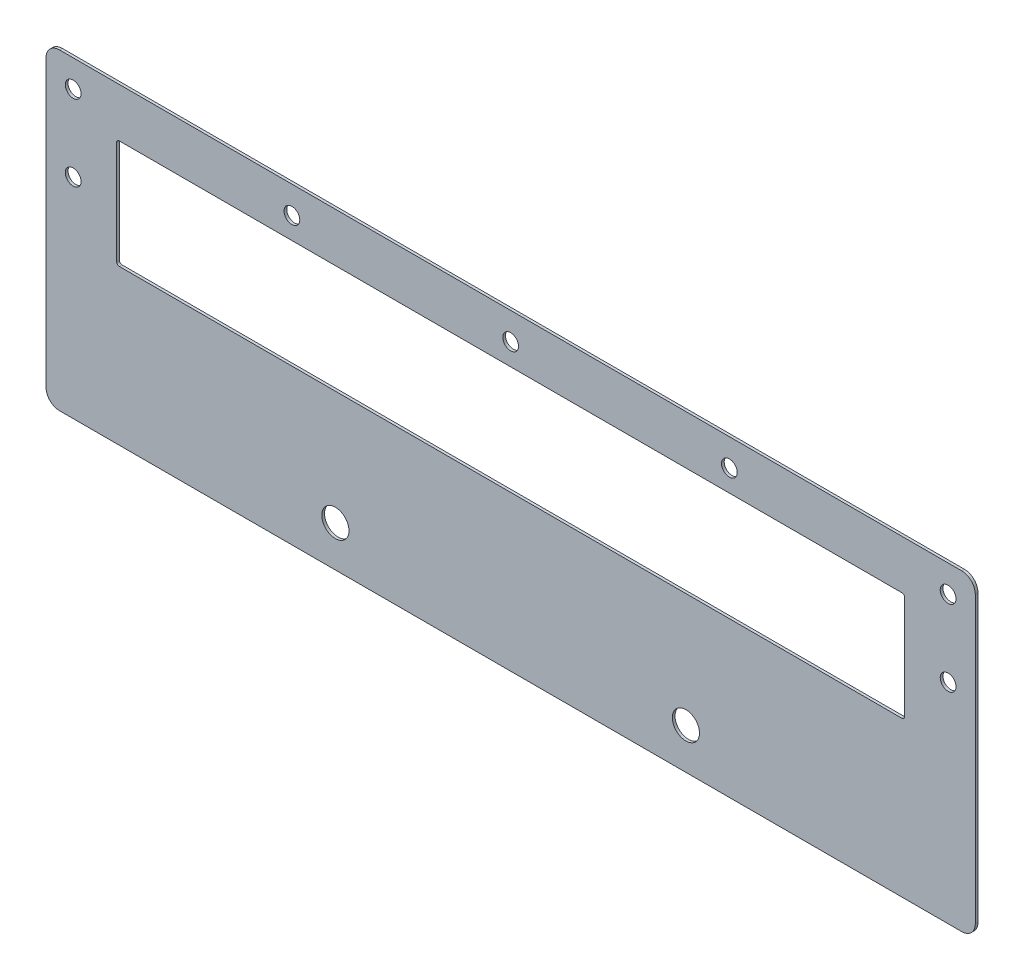
ISO-10303-21;
HEADER;
FILE_DESCRIPTION(('STEP AP214'),'2;1');
FILE_NAME('part.step','',(''),(''),'','','');
FILE_SCHEMA(('AUTOMOTIVE_DESIGN { 1 0 10303 214 1 1 1 1 }'));
ENDSEC;
DATA;
#1=APPLICATION_CONTEXT('core data for automotive mechanical design processes');
#2=APPLICATION_PROTOCOL_DEFINITION('international standard','automotive_design',2000,#1);
#3=PRODUCT_CONTEXT('',#1,'mechanical');
#4=PRODUCT('Part','Part','',(#3));
#5=PRODUCT_RELATED_PRODUCT_CATEGORY('part','',(#4));
#6=PRODUCT_DEFINITION_FORMATION('','',#4);
#7=PRODUCT_DEFINITION_CONTEXT('part definition',#1,'design');
#8=PRODUCT_DEFINITION('design','',#6,#7);
#9=PRODUCT_DEFINITION_SHAPE('','',#8);
#10=(LENGTH_UNIT() NAMED_UNIT(*) SI_UNIT(.MILLI.,.METRE.));
#11=(NAMED_UNIT(*) PLANE_ANGLE_UNIT() SI_UNIT($,.RADIAN.));
#12=(NAMED_UNIT(*) SI_UNIT($,.STERADIAN.) SOLID_ANGLE_UNIT());
#13=UNCERTAINTY_MEASURE_WITH_UNIT(LENGTH_MEASURE(1.E-05),#10,'distance_accuracy_value','');
#14=(GEOMETRIC_REPRESENTATION_CONTEXT(3) GLOBAL_UNCERTAINTY_ASSIGNED_CONTEXT((#13)) GLOBAL_UNIT_ASSIGNED_CONTEXT((#10,
#11,#12)) REPRESENTATION_CONTEXT('',''));
#15=CARTESIAN_POINT('',(0.,0.,0.));
#16=DIRECTION('',(0.,0.,1.));
#17=DIRECTION('',(1.,0.,0.));
#18=AXIS2_PLACEMENT_3D('',#15,#16,#17);
#19=CARTESIAN_POINT('',(0.,0.,1.));
#20=DIRECTION('',(0.,0.,1.));
#21=DIRECTION('',(1.,0.,0.));
#22=AXIS2_PLACEMENT_3D('',#19,#20,#21);
#23=PLANE('',#22);
#24=CARTESIAN_POINT('',(-64.4999999999998,-42.4999999999972,1.));
#25=DIRECTION('',(0.,0.,1.));
#26=DIRECTION('',(1.,0.,0.));
#27=AXIS2_PLACEMENT_3D('',#24,#25,#26);
#28=CIRCLE('',#27,5.);
#29=CARTESIAN_POINT('',(-59.4999999999998,-42.4999999999972,1.));
#30=VERTEX_POINT('',#29);
#31=EDGE_CURVE('E429',#30,#30,#28,.T.);
#32=ORIENTED_EDGE('',*,*,#31,.F.);
#33=EDGE_LOOP('',(#32));
#34=FACE_BOUND('',#33,.T.);
#35=CARTESIAN_POINT('',(64.5000000000002,-42.4999999999972,1.));
#36=DIRECTION('',(0.,0.,1.));
#37=DIRECTION('',(1.,0.,0.));
#38=AXIS2_PLACEMENT_3D('',#35,#36,#37);
#39=CIRCLE('',#38,5.);
#40=CARTESIAN_POINT('',(69.5000000000002,-42.4999999999972,1.));
#41=VERTEX_POINT('',#40);
#42=EDGE_CURVE('E423',#41,#41,#39,.T.);
#43=ORIENTED_EDGE('',*,*,#42,.F.);
#44=EDGE_LOOP('',(#43));
#45=FACE_BOUND('',#44,.T.);
#46=CARTESIAN_POINT('',(-161.,47.5000000000001,1.));
#47=DIRECTION('',(0.,0.,1.));
#48=DIRECTION('',(1.,0.,0.));
#49=AXIS2_PLACEMENT_3D('',#46,#47,#48);
#50=CIRCLE('',#49,2.89999999999999);
#51=CARTESIAN_POINT('',(-158.1,47.5000000000001,1.));
#52=VERTEX_POINT('',#51);
#53=EDGE_CURVE('E417',#52,#52,#50,.T.);
#54=ORIENTED_EDGE('',*,*,#53,.F.);
#55=EDGE_LOOP('',(#54));
#56=FACE_BOUND('',#55,.T.);
#57=CARTESIAN_POINT('',(-161.,19.5000000000001,1.));
#58=DIRECTION('',(0.,0.,1.));
#59=DIRECTION('',(1.,0.,0.));
#60=AXIS2_PLACEMENT_3D('',#57,#58,#59);
#61=CIRCLE('',#60,2.89999999999999);
#62=CARTESIAN_POINT('',(-158.1,19.5000000000001,1.));
#63=VERTEX_POINT('',#62);
#64=EDGE_CURVE('E411',#63,#63,#61,.T.);
#65=ORIENTED_EDGE('',*,*,#64,.F.);
#66=EDGE_LOOP('',(#65));
#67=FACE_BOUND('',#66,.T.);
#68=CARTESIAN_POINT('',(-80.5,47.4999999999985,1.));
#69=DIRECTION('',(0.,0.,1.));
#70=DIRECTION('',(1.,0.,0.));
#71=AXIS2_PLACEMENT_3D('',#68,#69,#70);
#72=CIRCLE('',#71,2.89999999999999);
#73=CARTESIAN_POINT('',(-77.6,47.4999999999985,1.));
#74=VERTEX_POINT('',#73);
#75=EDGE_CURVE('E405',#74,#74,#72,.T.);
#76=ORIENTED_EDGE('',*,*,#75,.F.);
#77=EDGE_LOOP('',(#76));
#78=FACE_BOUND('',#77,.T.);
#79=CARTESIAN_POINT('',(0.,47.4999999999985,1.));
#80=DIRECTION('',(0.,0.,1.));
#81=DIRECTION('',(1.,0.,0.));
#82=AXIS2_PLACEMENT_3D('',#79,#80,#81);
#83=CIRCLE('',#82,2.89999999999999);
#84=CARTESIAN_POINT('',(2.9,47.4999999999985,1.));
#85=VERTEX_POINT('',#84);
#86=EDGE_CURVE('E399',#85,#85,#83,.T.);
#87=ORIENTED_EDGE('',*,*,#86,.F.);
#88=EDGE_LOOP('',(#87));
#89=FACE_BOUND('',#88,.T.);
#90=CARTESIAN_POINT('',(80.5,47.4999999999984,1.));
#91=DIRECTION('',(0.,0.,1.));
#92=DIRECTION('',(1.,0.,0.));
#93=AXIS2_PLACEMENT_3D('',#90,#91,#92);
#94=CIRCLE('',#93,2.89999999999999);
#95=CARTESIAN_POINT('',(83.4,47.4999999999984,1.));
#96=VERTEX_POINT('',#95);
#97=EDGE_CURVE('E393',#96,#96,#94,.T.);
#98=ORIENTED_EDGE('',*,*,#97,.F.);
#99=EDGE_LOOP('',(#98));
#100=FACE_BOUND('',#99,.T.);
#101=CARTESIAN_POINT('',(161.,47.5,1.));
#102=DIRECTION('',(0.,0.,1.));
#103=DIRECTION('',(1.,0.,0.));
#104=AXIS2_PLACEMENT_3D('',#101,#102,#103);
#105=CIRCLE('',#104,2.89999999999999);
#106=CARTESIAN_POINT('',(163.9,47.5,1.));
#107=VERTEX_POINT('',#106);
#108=EDGE_CURVE('E387',#107,#107,#105,.T.);
#109=ORIENTED_EDGE('',*,*,#108,.F.);
#110=EDGE_LOOP('',(#109));
#111=FACE_BOUND('',#110,.T.);
#112=CARTESIAN_POINT('',(161.,19.5,1.));
#113=DIRECTION('',(0.,0.,1.));
#114=DIRECTION('',(1.,0.,0.));
#115=AXIS2_PLACEMENT_3D('',#112,#113,#114);
#116=CIRCLE('',#115,2.89999999999999);
#117=CARTESIAN_POINT('',(163.9,19.5,1.));
#118=VERTEX_POINT('',#117);
#119=EDGE_CURVE('E381',#118,#118,#116,.T.);
#120=ORIENTED_EDGE('',*,*,#119,.F.);
#121=EDGE_LOOP('',(#120));
#122=FACE_BOUND('',#121,.T.);
#123=DIRECTION('',(-1.,0.,0.));
#124=VECTOR('',#123,1.);
#125=CARTESIAN_POINT('',(171.,57.5,1.));
#126=LINE('',#125,#124);
#127=CARTESIAN_POINT('',(166.,57.5,1.));
#128=VERTEX_POINT('',#127);
#129=CARTESIAN_POINT('',(-166.,57.5,1.));
#130=VERTEX_POINT('',#129);
#131=EDGE_CURVE('E191',#128,#130,#126,.T.);
#132=ORIENTED_EDGE('',*,*,#131,.T.);
#133=CARTESIAN_POINT('',(-166.,52.5,1.));
#134=DIRECTION('',(0.,0.,1.));
#135=DIRECTION('',(1.,0.,0.));
#136=AXIS2_PLACEMENT_3D('',#133,#134,#135);
#137=CIRCLE('',#136,5.);
#138=CARTESIAN_POINT('',(-171.,52.5,1.));
#139=VERTEX_POINT('',#138);
#140=EDGE_CURVE('E211',#130,#139,#137,.T.);
#141=ORIENTED_EDGE('',*,*,#140,.T.);
#142=DIRECTION('',(0.,-1.,0.));
#143=VECTOR('',#142,1.);
#144=CARTESIAN_POINT('',(-171.,-57.5,1.));
#145=LINE('',#144,#143);
#146=CARTESIAN_POINT('',(-171.,-52.5,1.));
#147=VERTEX_POINT('',#146);
#148=EDGE_CURVE('E173',#139,#147,#145,.T.);
#149=ORIENTED_EDGE('',*,*,#148,.T.);
#150=CARTESIAN_POINT('',(-166.,-52.5,1.));
#151=DIRECTION('',(0.,0.,1.));
#152=DIRECTION('',(1.,0.,0.));
#153=AXIS2_PLACEMENT_3D('',#150,#151,#152);
#154=CIRCLE('',#153,5.);
#155=CARTESIAN_POINT('',(-166.,-57.5,1.));
#156=VERTEX_POINT('',#155);
#157=EDGE_CURVE('E207',#147,#156,#154,.T.);
#158=ORIENTED_EDGE('',*,*,#157,.T.);
#159=DIRECTION('',(1.,0.,0.));
#160=VECTOR('',#159,1.);
#161=CARTESIAN_POINT('',(171.,-57.5,1.));
#162=LINE('',#161,#160);
#163=CARTESIAN_POINT('',(166.,-57.5,1.));
#164=VERTEX_POINT('',#163);
#165=EDGE_CURVE('E289',#156,#164,#162,.T.);
#166=ORIENTED_EDGE('',*,*,#165,.T.);
#167=CARTESIAN_POINT('',(166.,-52.5,1.));
#168=DIRECTION('',(0.,0.,1.));
#169=DIRECTION('',(1.,0.,0.));
#170=AXIS2_PLACEMENT_3D('',#167,#168,#169);
#171=CIRCLE('',#170,5.);
#172=CARTESIAN_POINT('',(171.,-52.5,1.));
#173=VERTEX_POINT('',#172);
#174=EDGE_CURVE('E209',#164,#173,#171,.T.);
#175=ORIENTED_EDGE('',*,*,#174,.T.);
#176=DIRECTION('',(0.,1.,0.));
#177=VECTOR('',#176,1.);
#178=CARTESIAN_POINT('',(171.,-57.5,1.));
#179=LINE('',#178,#177);
#180=CARTESIAN_POINT('',(171.,52.5000000000001,1.));
#181=VERTEX_POINT('',#180);
#182=EDGE_CURVE('E291',#173,#181,#179,.T.);
#183=ORIENTED_EDGE('',*,*,#182,.T.);
#184=CARTESIAN_POINT('',(166.,52.5,1.));
#185=DIRECTION('',(0.,0.,1.));
#186=DIRECTION('',(1.,0.,0.));
#187=AXIS2_PLACEMENT_3D('',#184,#185,#186);
#188=CIRCLE('',#187,5.);
#189=EDGE_CURVE('E205',#181,#128,#188,.T.);
#190=ORIENTED_EDGE('',*,*,#189,.T.);
#191=EDGE_LOOP('',(#132,#141,#149,#158,#166,#175,#183,#190));
#192=FACE_BOUND('',#191,.T.);
#193=DIRECTION('',(0.,1.,0.));
#194=VECTOR('',#193,1.);
#195=CARTESIAN_POINT('',(145.,-0.499999999997223,1.));
#196=LINE('',#195,#194);
#197=CARTESIAN_POINT('',(145.,0.500000000002777,1.));
#198=VERTEX_POINT('',#197);
#199=CARTESIAN_POINT('',(145.,38.5000000000028,1.));
#200=VERTEX_POINT('',#199);
#201=EDGE_CURVE('E274',#198,#200,#196,.T.);
#202=ORIENTED_EDGE('',*,*,#201,.F.);
#203=CARTESIAN_POINT('',(144.,0.500000000002777,1.));
#204=DIRECTION('',(0.,0.,1.));
#205=DIRECTION('',(1.,0.,0.));
#206=AXIS2_PLACEMENT_3D('',#203,#204,#205);
#207=CIRCLE('',#206,1.);
#208=CARTESIAN_POINT('',(144.,-0.499999999997223,1.));
#209=VERTEX_POINT('',#208);
#210=EDGE_CURVE('E54',#198,#209,#207,.F.);
#211=ORIENTED_EDGE('',*,*,#210,.T.);
#212=DIRECTION('',(1.,0.,0.));
#213=VECTOR('',#212,1.);
#214=CARTESIAN_POINT('',(145.,-0.499999999997223,1.));
#215=LINE('',#214,#213);
#216=CARTESIAN_POINT('',(-144.,-0.499999999997259,1.));
#217=VERTEX_POINT('',#216);
#218=EDGE_CURVE('E265',#217,#209,#215,.T.);
#219=ORIENTED_EDGE('',*,*,#218,.F.);
#220=CARTESIAN_POINT('',(-144.,0.500000000002741,1.));
#221=DIRECTION('',(0.,0.,1.));
#222=DIRECTION('',(1.,0.,0.));
#223=AXIS2_PLACEMENT_3D('',#220,#221,#222);
#224=CIRCLE('',#223,1.);
#225=CARTESIAN_POINT('',(-145.,0.500000000002741,1.));
#226=VERTEX_POINT('',#225);
#227=EDGE_CURVE('E248',#217,#226,#224,.F.);
#228=ORIENTED_EDGE('',*,*,#227,.T.);
#229=DIRECTION('',(0.,-1.,0.));
#230=VECTOR('',#229,1.);
#231=CARTESIAN_POINT('',(-145.,-0.499999999997259,1.));
#232=LINE('',#231,#230);
#233=CARTESIAN_POINT('',(-145.,38.5000000000028,1.));
#234=VERTEX_POINT('',#233);
#235=EDGE_CURVE('E182',#234,#226,#232,.T.);
#236=ORIENTED_EDGE('',*,*,#235,.F.);
#237=CARTESIAN_POINT('',(-144.,38.5000000000028,1.));
#238=DIRECTION('',(0.,0.,1.));
#239=DIRECTION('',(1.,0.,0.));
#240=AXIS2_PLACEMENT_3D('',#237,#238,#239);
#241=CIRCLE('',#240,1.);
#242=CARTESIAN_POINT('',(-144.,39.5000000000028,1.));
#243=VERTEX_POINT('',#242);
#244=EDGE_CURVE('E11',#234,#243,#241,.F.);
#245=ORIENTED_EDGE('',*,*,#244,.T.);
#246=DIRECTION('',(-1.,0.,0.));
#247=VECTOR('',#246,1.);
#248=CARTESIAN_POINT('',(145.,39.5000000000028,1.));
#249=LINE('',#248,#247);
#250=CARTESIAN_POINT('',(144.,39.5000000000028,1.));
#251=VERTEX_POINT('',#250);
#252=EDGE_CURVE('E188',#251,#243,#249,.T.);
#253=ORIENTED_EDGE('',*,*,#252,.F.);
#254=CARTESIAN_POINT('',(144.,38.5000000000028,1.));
#255=DIRECTION('',(0.,0.,1.));
#256=DIRECTION('',(1.,0.,0.));
#257=AXIS2_PLACEMENT_3D('',#254,#255,#256);
#258=CIRCLE('',#257,1.);
#259=EDGE_CURVE('E244',#251,#200,#258,.F.);
#260=ORIENTED_EDGE('',*,*,#259,.T.);
#261=EDGE_LOOP('',(#202,#211,#219,#228,#236,#245,#253,#260));
#262=FACE_BOUND('',#261,.T.);
#263=ADVANCED_FACE('F39',(#34,#45,#56,#67,#78,#89,#100,#111,#122,#192,#262),#23,.T.);
#264=CARTESIAN_POINT('',(0.,0.,0.));
#265=DIRECTION('',(0.,0.,1.));
#266=DIRECTION('',(1.,0.,0.));
#267=AXIS2_PLACEMENT_3D('',#264,#265,#266);
#268=PLANE('',#267);
#269=CARTESIAN_POINT('',(-64.4999999999998,-42.4999999999972,0.));
#270=DIRECTION('',(0.,0.,1.));
#271=DIRECTION('',(1.,0.,0.));
#272=AXIS2_PLACEMENT_3D('',#269,#270,#271);
#273=CIRCLE('',#272,5.);
#274=CARTESIAN_POINT('',(-59.4999999999998,-42.4999999999972,0.));
#275=VERTEX_POINT('',#274);
#276=EDGE_CURVE('E426',#275,#275,#273,.T.);
#277=ORIENTED_EDGE('',*,*,#276,.T.);
#278=EDGE_LOOP('',(#277));
#279=FACE_BOUND('',#278,.T.);
#280=CARTESIAN_POINT('',(64.5000000000002,-42.4999999999972,0.));
#281=DIRECTION('',(0.,0.,1.));
#282=DIRECTION('',(1.,0.,0.));
#283=AXIS2_PLACEMENT_3D('',#280,#281,#282);
#284=CIRCLE('',#283,5.);
#285=CARTESIAN_POINT('',(69.5000000000002,-42.4999999999972,0.));
#286=VERTEX_POINT('',#285);
#287=EDGE_CURVE('E420',#286,#286,#284,.T.);
#288=ORIENTED_EDGE('',*,*,#287,.T.);
#289=EDGE_LOOP('',(#288));
#290=FACE_BOUND('',#289,.T.);
#291=CARTESIAN_POINT('',(-161.,47.5000000000001,0.));
#292=DIRECTION('',(0.,0.,1.));
#293=DIRECTION('',(1.,0.,0.));
#294=AXIS2_PLACEMENT_3D('',#291,#292,#293);
#295=CIRCLE('',#294,2.89999999999999);
#296=CARTESIAN_POINT('',(-158.1,47.5000000000001,0.));
#297=VERTEX_POINT('',#296);
#298=EDGE_CURVE('E414',#297,#297,#295,.T.);
#299=ORIENTED_EDGE('',*,*,#298,.T.);
#300=EDGE_LOOP('',(#299));
#301=FACE_BOUND('',#300,.T.);
#302=CARTESIAN_POINT('',(-161.,19.5000000000001,0.));
#303=DIRECTION('',(0.,0.,1.));
#304=DIRECTION('',(1.,0.,0.));
#305=AXIS2_PLACEMENT_3D('',#302,#303,#304);
#306=CIRCLE('',#305,2.89999999999999);
#307=CARTESIAN_POINT('',(-158.1,19.5000000000001,0.));
#308=VERTEX_POINT('',#307);
#309=EDGE_CURVE('E408',#308,#308,#306,.T.);
#310=ORIENTED_EDGE('',*,*,#309,.T.);
#311=EDGE_LOOP('',(#310));
#312=FACE_BOUND('',#311,.T.);
#313=CARTESIAN_POINT('',(-80.5,47.4999999999985,0.));
#314=DIRECTION('',(0.,0.,1.));
#315=DIRECTION('',(1.,0.,0.));
#316=AXIS2_PLACEMENT_3D('',#313,#314,#315);
#317=CIRCLE('',#316,2.9);
#318=CARTESIAN_POINT('',(-77.6,47.4999999999985,0.));
#319=VERTEX_POINT('',#318);
#320=EDGE_CURVE('E402',#319,#319,#317,.T.);
#321=ORIENTED_EDGE('',*,*,#320,.T.);
#322=EDGE_LOOP('',(#321));
#323=FACE_BOUND('',#322,.T.);
#324=CARTESIAN_POINT('',(0.,47.4999999999985,0.));
#325=DIRECTION('',(0.,0.,1.));
#326=DIRECTION('',(1.,0.,0.));
#327=AXIS2_PLACEMENT_3D('',#324,#325,#326);
#328=CIRCLE('',#327,2.9);
#329=CARTESIAN_POINT('',(2.90000000000001,47.4999999999985,0.));
#330=VERTEX_POINT('',#329);
#331=EDGE_CURVE('E396',#330,#330,#328,.T.);
#332=ORIENTED_EDGE('',*,*,#331,.T.);
#333=EDGE_LOOP('',(#332));
#334=FACE_BOUND('',#333,.T.);
#335=CARTESIAN_POINT('',(80.5,47.4999999999984,0.));
#336=DIRECTION('',(0.,0.,1.));
#337=DIRECTION('',(1.,0.,0.));
#338=AXIS2_PLACEMENT_3D('',#335,#336,#337);
#339=CIRCLE('',#338,2.9);
#340=CARTESIAN_POINT('',(83.4,47.4999999999984,0.));
#341=VERTEX_POINT('',#340);
#342=EDGE_CURVE('E390',#341,#341,#339,.T.);
#343=ORIENTED_EDGE('',*,*,#342,.T.);
#344=EDGE_LOOP('',(#343));
#345=FACE_BOUND('',#344,.T.);
#346=CARTESIAN_POINT('',(161.,47.5,0.));
#347=DIRECTION('',(0.,0.,1.));
#348=DIRECTION('',(1.,0.,0.));
#349=AXIS2_PLACEMENT_3D('',#346,#347,#348);
#350=CIRCLE('',#349,2.89999999999999);
#351=CARTESIAN_POINT('',(163.9,47.5,0.));
#352=VERTEX_POINT('',#351);
#353=EDGE_CURVE('E384',#352,#352,#350,.T.);
#354=ORIENTED_EDGE('',*,*,#353,.T.);
#355=EDGE_LOOP('',(#354));
#356=FACE_BOUND('',#355,.T.);
#357=CARTESIAN_POINT('',(161.,19.5,0.));
#358=DIRECTION('',(0.,0.,1.));
#359=DIRECTION('',(1.,0.,0.));
#360=AXIS2_PLACEMENT_3D('',#357,#358,#359);
#361=CIRCLE('',#360,2.89999999999999);
#362=CARTESIAN_POINT('',(163.9,19.5,0.));
#363=VERTEX_POINT('',#362);
#364=EDGE_CURVE('E284',#363,#363,#361,.T.);
#365=ORIENTED_EDGE('',*,*,#364,.T.);
#366=EDGE_LOOP('',(#365));
#367=FACE_BOUND('',#366,.T.);
#368=DIRECTION('',(0.,-1.,0.));
#369=VECTOR('',#368,1.);
#370=CARTESIAN_POINT('',(-171.,-57.5,0.));
#371=LINE('',#370,#369);
#372=CARTESIAN_POINT('',(-171.,52.5,0.));
#373=VERTEX_POINT('',#372);
#374=CARTESIAN_POINT('',(-171.,-52.5,0.));
#375=VERTEX_POINT('',#374);
#376=EDGE_CURVE('E170',#373,#375,#371,.T.);
#377=ORIENTED_EDGE('',*,*,#376,.F.);
#378=CARTESIAN_POINT('',(-166.,52.5,0.));
#379=DIRECTION('',(0.,0.,1.));
#380=DIRECTION('',(1.,0.,0.));
#381=AXIS2_PLACEMENT_3D('',#378,#379,#380);
#382=CIRCLE('',#381,5.);
#383=CARTESIAN_POINT('',(-166.,57.5,0.));
#384=VERTEX_POINT('',#383);
#385=EDGE_CURVE('E153',#373,#384,#382,.F.);
#386=ORIENTED_EDGE('',*,*,#385,.T.);
#387=DIRECTION('',(-1.,0.,0.));
#388=VECTOR('',#387,1.);
#389=CARTESIAN_POINT('',(171.,57.5,0.));
#390=LINE('',#389,#388);
#391=CARTESIAN_POINT('',(166.,57.5,0.));
#392=VERTEX_POINT('',#391);
#393=EDGE_CURVE('E196',#392,#384,#390,.T.);
#394=ORIENTED_EDGE('',*,*,#393,.F.);
#395=CARTESIAN_POINT('',(166.,52.5,0.));
#396=DIRECTION('',(0.,0.,1.));
#397=DIRECTION('',(1.,0.,0.));
#398=AXIS2_PLACEMENT_3D('',#395,#396,#397);
#399=CIRCLE('',#398,5.);
#400=CARTESIAN_POINT('',(171.,52.5000000000001,0.));
#401=VERTEX_POINT('',#400);
#402=EDGE_CURVE('E174',#392,#401,#399,.F.);
#403=ORIENTED_EDGE('',*,*,#402,.T.);
#404=DIRECTION('',(0.,1.,0.));
#405=VECTOR('',#404,1.);
#406=CARTESIAN_POINT('',(171.,-57.5,0.));
#407=LINE('',#406,#405);
#408=CARTESIAN_POINT('',(171.,-52.5,0.));
#409=VERTEX_POINT('',#408);
#410=EDGE_CURVE('E185',#409,#401,#407,.T.);
#411=ORIENTED_EDGE('',*,*,#410,.F.);
#412=CARTESIAN_POINT('',(166.,-52.5,0.));
#413=DIRECTION('',(0.,0.,1.));
#414=DIRECTION('',(1.,0.,0.));
#415=AXIS2_PLACEMENT_3D('',#412,#413,#414);
#416=CIRCLE('',#415,5.);
#417=CARTESIAN_POINT('',(166.,-57.5,0.));
#418=VERTEX_POINT('',#417);
#419=EDGE_CURVE('E164',#409,#418,#416,.F.);
#420=ORIENTED_EDGE('',*,*,#419,.T.);
#421=DIRECTION('',(1.,0.,0.));
#422=VECTOR('',#421,1.);
#423=CARTESIAN_POINT('',(171.,-57.5,0.));
#424=LINE('',#423,#422);
#425=CARTESIAN_POINT('',(-166.,-57.5,0.));
#426=VERTEX_POINT('',#425);
#427=EDGE_CURVE('E181',#426,#418,#424,.T.);
#428=ORIENTED_EDGE('',*,*,#427,.F.);
#429=CARTESIAN_POINT('',(-166.,-52.5,0.));
#430=DIRECTION('',(0.,0.,1.));
#431=DIRECTION('',(1.,0.,0.));
#432=AXIS2_PLACEMENT_3D('',#429,#430,#431);
#433=CIRCLE('',#432,5.);
#434=EDGE_CURVE('E180',#426,#375,#433,.F.);
#435=ORIENTED_EDGE('',*,*,#434,.T.);
#436=EDGE_LOOP('',(#377,#386,#394,#403,#411,#420,#428,#435));
#437=FACE_BOUND('',#436,.T.);
#438=DIRECTION('',(0.,-1.,0.));
#439=VECTOR('',#438,1.);
#440=CARTESIAN_POINT('',(-145.,-0.499999999997259,0.));
#441=LINE('',#440,#439);
#442=CARTESIAN_POINT('',(-145.,38.5000000000028,0.));
#443=VERTEX_POINT('',#442);
#444=CARTESIAN_POINT('',(-145.,0.500000000002741,0.));
#445=VERTEX_POINT('',#444);
#446=EDGE_CURVE('E255',#443,#445,#441,.T.);
#447=ORIENTED_EDGE('',*,*,#446,.T.);
#448=CARTESIAN_POINT('',(-144.,0.500000000002741,0.));
#449=DIRECTION('',(0.,0.,1.));
#450=DIRECTION('',(1.,0.,0.));
#451=AXIS2_PLACEMENT_3D('',#448,#449,#450);
#452=CIRCLE('',#451,1.);
#453=CARTESIAN_POINT('',(-144.,-0.499999999997259,0.));
#454=VERTEX_POINT('',#453);
#455=EDGE_CURVE('E246',#445,#454,#452,.T.);
#456=ORIENTED_EDGE('',*,*,#455,.T.);
#457=DIRECTION('',(1.,0.,0.));
#458=VECTOR('',#457,1.);
#459=CARTESIAN_POINT('',(145.,-0.499999999997223,0.));
#460=LINE('',#459,#458);
#461=CARTESIAN_POINT('',(144.,-0.499999999997223,0.));
#462=VERTEX_POINT('',#461);
#463=EDGE_CURVE('E280',#454,#462,#460,.T.);
#464=ORIENTED_EDGE('',*,*,#463,.T.);
#465=CARTESIAN_POINT('',(144.,0.500000000002777,0.));
#466=DIRECTION('',(0.,0.,1.));
#467=DIRECTION('',(1.,0.,0.));
#468=AXIS2_PLACEMENT_3D('',#465,#466,#467);
#469=CIRCLE('',#468,1.);
#470=CARTESIAN_POINT('',(145.,0.500000000002777,0.));
#471=VERTEX_POINT('',#470);
#472=EDGE_CURVE('E250',#462,#471,#469,.T.);
#473=ORIENTED_EDGE('',*,*,#472,.T.);
#474=DIRECTION('',(0.,1.,0.));
#475=VECTOR('',#474,1.);
#476=CARTESIAN_POINT('',(145.,-0.499999999997223,0.));
#477=LINE('',#476,#475);
#478=CARTESIAN_POINT('',(145.,38.5000000000028,0.));
#479=VERTEX_POINT('',#478);
#480=EDGE_CURVE('E283',#471,#479,#477,.T.);
#481=ORIENTED_EDGE('',*,*,#480,.T.);
#482=CARTESIAN_POINT('',(144.,38.5000000000028,0.));
#483=DIRECTION('',(0.,0.,1.));
#484=DIRECTION('',(1.,0.,0.));
#485=AXIS2_PLACEMENT_3D('',#482,#483,#484);
#486=CIRCLE('',#485,1.);
#487=CARTESIAN_POINT('',(144.,39.5000000000028,0.));
#488=VERTEX_POINT('',#487);
#489=EDGE_CURVE('E242',#479,#488,#486,.T.);
#490=ORIENTED_EDGE('',*,*,#489,.T.);
#491=DIRECTION('',(-1.,0.,0.));
#492=VECTOR('',#491,1.);
#493=CARTESIAN_POINT('',(145.,39.5000000000028,0.));
#494=LINE('',#493,#492);
#495=CARTESIAN_POINT('',(-144.,39.5000000000028,0.));
#496=VERTEX_POINT('',#495);
#497=EDGE_CURVE('E257',#488,#496,#494,.T.);
#498=ORIENTED_EDGE('',*,*,#497,.T.);
#499=CARTESIAN_POINT('',(-144.,38.5000000000028,0.));
#500=DIRECTION('',(0.,0.,1.));
#501=DIRECTION('',(1.,0.,0.));
#502=AXIS2_PLACEMENT_3D('',#499,#500,#501);
#503=CIRCLE('',#502,1.);
#504=EDGE_CURVE('E47',#496,#443,#503,.T.);
#505=ORIENTED_EDGE('',*,*,#504,.T.);
#506=EDGE_LOOP('',(#447,#456,#464,#473,#481,#490,#498,#505));
#507=FACE_BOUND('',#506,.T.);
#508=ADVANCED_FACE('F177',(#279,#290,#301,#312,#323,#334,#345,#356,#367,#437,#507),#268,.F.);
#509=CARTESIAN_POINT('',(-171.,-57.5,1.));
#510=DIRECTION('',(1.,0.,0.));
#511=DIRECTION('',(0.,0.,-1.));
#512=AXIS2_PLACEMENT_3D('',#509,#510,#511);
#513=PLANE('',#512);
#514=ORIENTED_EDGE('',*,*,#148,.F.);
#515=DIRECTION('',(0.,0.,-1.));
#516=VECTOR('',#515,1.);
#517=CARTESIAN_POINT('',(-171.,52.5,1.));
#518=LINE('',#517,#516);
#519=EDGE_CURVE('E157',#139,#373,#518,.T.);
#520=ORIENTED_EDGE('',*,*,#519,.T.);
#521=ORIENTED_EDGE('',*,*,#376,.T.);
#522=DIRECTION('',(0.,0.,-1.));
#523=VECTOR('',#522,1.);
#524=CARTESIAN_POINT('',(-171.,-52.5,1.));
#525=LINE('',#524,#523);
#526=EDGE_CURVE('E175',#375,#147,#525,.F.);
#527=ORIENTED_EDGE('',*,*,#526,.T.);
#528=EDGE_LOOP('',(#514,#520,#521,#527));
#529=FACE_BOUND('',#528,.T.);
#530=ADVANCED_FACE('F169',(#529),#513,.F.);
#531=CARTESIAN_POINT('',(171.,-57.5,1.));
#532=DIRECTION('',(0.,1.,0.));
#533=DIRECTION('',(-1.,0.,0.));
#534=AXIS2_PLACEMENT_3D('',#531,#532,#533);
#535=PLANE('',#534);
#536=ORIENTED_EDGE('',*,*,#427,.T.);
#537=DIRECTION('',(0.,0.,-1.));
#538=VECTOR('',#537,1.);
#539=CARTESIAN_POINT('',(166.,-57.5,1.));
#540=LINE('',#539,#538);
#541=EDGE_CURVE('E221',#418,#164,#540,.F.);
#542=ORIENTED_EDGE('',*,*,#541,.T.);
#543=ORIENTED_EDGE('',*,*,#165,.F.);
#544=DIRECTION('',(0.,0.,-1.));
#545=VECTOR('',#544,1.);
#546=CARTESIAN_POINT('',(-166.,-57.5,1.));
#547=LINE('',#546,#545);
#548=EDGE_CURVE('E218',#156,#426,#547,.T.);
#549=ORIENTED_EDGE('',*,*,#548,.T.);
#550=EDGE_LOOP('',(#536,#542,#543,#549));
#551=FACE_BOUND('',#550,.T.);
#552=ADVANCED_FACE('F313',(#551),#535,.F.);
#553=CARTESIAN_POINT('',(171.,-57.5,1.));
#554=DIRECTION('',(-1.,0.,0.));
#555=DIRECTION('',(0.,0.,1.));
#556=AXIS2_PLACEMENT_3D('',#553,#554,#555);
#557=PLANE('',#556);
#558=ORIENTED_EDGE('',*,*,#182,.F.);
#559=DIRECTION('',(0.,0.,-1.));
#560=VECTOR('',#559,1.);
#561=CARTESIAN_POINT('',(171.,-52.5,1.));
#562=LINE('',#561,#560);
#563=EDGE_CURVE('E215',#173,#409,#562,.T.);
#564=ORIENTED_EDGE('',*,*,#563,.T.);
#565=ORIENTED_EDGE('',*,*,#410,.T.);
#566=DIRECTION('',(0.,0.,-1.));
#567=VECTOR('',#566,1.);
#568=CARTESIAN_POINT('',(171.,52.5000000000001,1.));
#569=LINE('',#568,#567);
#570=EDGE_CURVE('E213',#401,#181,#569,.F.);
#571=ORIENTED_EDGE('',*,*,#570,.T.);
#572=EDGE_LOOP('',(#558,#564,#565,#571));
#573=FACE_BOUND('',#572,.T.);
#574=ADVANCED_FACE('F306',(#573),#557,.F.);
#575=CARTESIAN_POINT('',(171.,57.5,1.));
#576=DIRECTION('',(0.,-1.,0.));
#577=DIRECTION('',(1.,0.,0.));
#578=AXIS2_PLACEMENT_3D('',#575,#576,#577);
#579=PLANE('',#578);
#580=ORIENTED_EDGE('',*,*,#393,.T.);
#581=DIRECTION('',(0.,0.,-1.));
#582=VECTOR('',#581,1.);
#583=CARTESIAN_POINT('',(-166.,57.5,1.));
#584=LINE('',#583,#582);
#585=EDGE_CURVE('E158',#384,#130,#584,.F.);
#586=ORIENTED_EDGE('',*,*,#585,.T.);
#587=ORIENTED_EDGE('',*,*,#131,.F.);
#588=DIRECTION('',(0.,0.,-1.));
#589=VECTOR('',#588,1.);
#590=CARTESIAN_POINT('',(166.,57.5,1.));
#591=LINE('',#590,#589);
#592=EDGE_CURVE('E163',#128,#392,#591,.T.);
#593=ORIENTED_EDGE('',*,*,#592,.T.);
#594=EDGE_LOOP('',(#580,#586,#587,#593));
#595=FACE_BOUND('',#594,.T.);
#596=ADVANCED_FACE('F300',(#595),#579,.F.);
#597=CARTESIAN_POINT('',(145.,-0.499999999997223,1.));
#598=DIRECTION('',(0.,1.,0.));
#599=DIRECTION('',(-1.,0.,0.));
#600=AXIS2_PLACEMENT_3D('',#597,#598,#599);
#601=PLANE('',#600);
#602=ORIENTED_EDGE('',*,*,#463,.F.);
#603=DIRECTION('',(0.,0.,-1.));
#604=VECTOR('',#603,1.);
#605=CARTESIAN_POINT('',(-144.,-0.499999999997259,1.));
#606=LINE('',#605,#604);
#607=EDGE_CURVE('E61',#454,#217,#606,.F.);
#608=ORIENTED_EDGE('',*,*,#607,.T.);
#609=ORIENTED_EDGE('',*,*,#218,.T.);
#610=DIRECTION('',(0.,0.,-1.));
#611=VECTOR('',#610,1.);
#612=CARTESIAN_POINT('',(144.,-0.499999999997224,0.));
#613=LINE('',#612,#611);
#614=EDGE_CURVE('E238',#209,#462,#613,.T.);
#615=ORIENTED_EDGE('',*,*,#614,.T.);
#616=EDGE_LOOP('',(#602,#608,#609,#615));
#617=FACE_BOUND('',#616,.T.);
#618=ADVANCED_FACE('F339',(#617),#601,.T.);
#619=CARTESIAN_POINT('',(145.,-0.499999999997223,1.));
#620=DIRECTION('',(-1.,0.,0.));
#621=DIRECTION('',(0.,0.,1.));
#622=AXIS2_PLACEMENT_3D('',#619,#620,#621);
#623=PLANE('',#622);
#624=ORIENTED_EDGE('',*,*,#201,.T.);
#625=DIRECTION('',(0.,0.,-1.));
#626=VECTOR('',#625,1.);
#627=CARTESIAN_POINT('',(145.,38.5000000000028,0.));
#628=LINE('',#627,#626);
#629=EDGE_CURVE('E225',#200,#479,#628,.T.);
#630=ORIENTED_EDGE('',*,*,#629,.T.);
#631=ORIENTED_EDGE('',*,*,#480,.F.);
#632=DIRECTION('',(0.,0.,-1.));
#633=VECTOR('',#632,1.);
#634=CARTESIAN_POINT('',(145.,0.500000000002777,1.));
#635=LINE('',#634,#633);
#636=EDGE_CURVE('E223',#471,#198,#635,.F.);
#637=ORIENTED_EDGE('',*,*,#636,.T.);
#638=EDGE_LOOP('',(#624,#630,#631,#637));
#639=FACE_BOUND('',#638,.T.);
#640=ADVANCED_FACE('F358',(#639),#623,.T.);
#641=CARTESIAN_POINT('',(145.,39.5000000000028,1.));
#642=DIRECTION('',(0.,-1.,0.));
#643=DIRECTION('',(0.,0.,-1.));
#644=AXIS2_PLACEMENT_3D('',#641,#642,#643);
#645=PLANE('',#644);
#646=ORIENTED_EDGE('',*,*,#497,.F.);
#647=DIRECTION('',(0.,0.,-1.));
#648=VECTOR('',#647,1.);
#649=CARTESIAN_POINT('',(144.,39.5000000000028,1.));
#650=LINE('',#649,#648);
#651=EDGE_CURVE('E231',#488,#251,#650,.F.);
#652=ORIENTED_EDGE('',*,*,#651,.T.);
#653=ORIENTED_EDGE('',*,*,#252,.T.);
#654=DIRECTION('',(0.,0.,-1.));
#655=VECTOR('',#654,1.);
#656=CARTESIAN_POINT('',(-144.,39.5000000000028,0.));
#657=LINE('',#656,#655);
#658=EDGE_CURVE('E228',#243,#496,#657,.T.);
#659=ORIENTED_EDGE('',*,*,#658,.T.);
#660=EDGE_LOOP('',(#646,#652,#653,#659));
#661=FACE_BOUND('',#660,.T.);
#662=ADVANCED_FACE('F272',(#661),#645,.T.);
#663=CARTESIAN_POINT('',(-145.,-0.499999999997259,1.));
#664=DIRECTION('',(1.,0.,0.));
#665=DIRECTION('',(0.,0.,-1.));
#666=AXIS2_PLACEMENT_3D('',#663,#664,#665);
#667=PLANE('',#666);
#668=ORIENTED_EDGE('',*,*,#235,.T.);
#669=DIRECTION('',(0.,0.,-1.));
#670=VECTOR('',#669,1.);
#671=CARTESIAN_POINT('',(-145.,0.500000000002741,0.));
#672=LINE('',#671,#670);
#673=EDGE_CURVE('E235',#226,#445,#672,.T.);
#674=ORIENTED_EDGE('',*,*,#673,.T.);
#675=ORIENTED_EDGE('',*,*,#446,.F.);
#676=DIRECTION('',(0.,0.,-1.));
#677=VECTOR('',#676,1.);
#678=CARTESIAN_POINT('',(-145.,38.5000000000028,1.));
#679=LINE('',#678,#677);
#680=EDGE_CURVE('E233',#443,#234,#679,.F.);
#681=ORIENTED_EDGE('',*,*,#680,.T.);
#682=EDGE_LOOP('',(#668,#674,#675,#681));
#683=FACE_BOUND('',#682,.T.);
#684=ADVANCED_FACE('F262',(#683),#667,.T.);
#685=CARTESIAN_POINT('',(-166.,52.5,1.));
#686=DIRECTION('',(0.,0.,-1.));
#687=DIRECTION('',(-1.,0.,0.));
#688=AXIS2_PLACEMENT_3D('',#685,#686,#687);
#689=CYLINDRICAL_SURFACE('',#688,5.);
#690=ORIENTED_EDGE('',*,*,#140,.F.);
#691=ORIENTED_EDGE('',*,*,#585,.F.);
#692=ORIENTED_EDGE('',*,*,#385,.F.);
#693=ORIENTED_EDGE('',*,*,#519,.F.);
#694=EDGE_LOOP('',(#690,#691,#692,#693));
#695=FACE_BOUND('',#694,.T.);
#696=ADVANCED_FACE('F156',(#695),#689,.T.);
#697=CARTESIAN_POINT('',(166.,-52.5,1.));
#698=DIRECTION('',(0.,0.,-1.));
#699=DIRECTION('',(-1.,0.,0.));
#700=AXIS2_PLACEMENT_3D('',#697,#698,#699);
#701=CYLINDRICAL_SURFACE('',#700,5.);
#702=ORIENTED_EDGE('',*,*,#174,.F.);
#703=ORIENTED_EDGE('',*,*,#541,.F.);
#704=ORIENTED_EDGE('',*,*,#419,.F.);
#705=ORIENTED_EDGE('',*,*,#563,.F.);
#706=EDGE_LOOP('',(#702,#703,#704,#705));
#707=FACE_BOUND('',#706,.T.);
#708=ADVANCED_FACE('F310',(#707),#701,.T.);
#709=CARTESIAN_POINT('',(-166.,-52.5,1.));
#710=DIRECTION('',(0.,0.,-1.));
#711=DIRECTION('',(-1.,0.,0.));
#712=AXIS2_PLACEMENT_3D('',#709,#710,#711);
#713=CYLINDRICAL_SURFACE('',#712,5.);
#714=ORIENTED_EDGE('',*,*,#157,.F.);
#715=ORIENTED_EDGE('',*,*,#526,.F.);
#716=ORIENTED_EDGE('',*,*,#434,.F.);
#717=ORIENTED_EDGE('',*,*,#548,.F.);
#718=EDGE_LOOP('',(#714,#715,#716,#717));
#719=FACE_BOUND('',#718,.T.);
#720=ADVANCED_FACE('F318',(#719),#713,.T.);
#721=CARTESIAN_POINT('',(166.,52.5,1.));
#722=DIRECTION('',(0.,0.,-1.));
#723=DIRECTION('',(-1.,0.,0.));
#724=AXIS2_PLACEMENT_3D('',#721,#722,#723);
#725=CYLINDRICAL_SURFACE('',#724,5.);
#726=ORIENTED_EDGE('',*,*,#189,.F.);
#727=ORIENTED_EDGE('',*,*,#570,.F.);
#728=ORIENTED_EDGE('',*,*,#402,.F.);
#729=ORIENTED_EDGE('',*,*,#592,.F.);
#730=EDGE_LOOP('',(#726,#727,#728,#729));
#731=FACE_BOUND('',#730,.T.);
#732=ADVANCED_FACE('F302',(#731),#725,.T.);
#733=CARTESIAN_POINT('',(144.,38.5000000000028,1.));
#734=DIRECTION('',(0.,0.,1.));
#735=DIRECTION('',(1.,0.,0.));
#736=AXIS2_PLACEMENT_3D('',#733,#734,#735);
#737=CYLINDRICAL_SURFACE('',#736,1.);
#738=ORIENTED_EDGE('',*,*,#259,.F.);
#739=ORIENTED_EDGE('',*,*,#651,.F.);
#740=ORIENTED_EDGE('',*,*,#489,.F.);
#741=ORIENTED_EDGE('',*,*,#629,.F.);
#742=EDGE_LOOP('',(#738,#739,#740,#741));
#743=FACE_BOUND('',#742,.T.);
#744=ADVANCED_FACE('F325',(#743),#737,.F.);
#745=CARTESIAN_POINT('',(-144.,0.500000000002741,1.));
#746=DIRECTION('',(0.,0.,1.));
#747=DIRECTION('',(1.,0.,0.));
#748=AXIS2_PLACEMENT_3D('',#745,#746,#747);
#749=CYLINDRICAL_SURFACE('',#748,1.);
#750=ORIENTED_EDGE('',*,*,#227,.F.);
#751=ORIENTED_EDGE('',*,*,#607,.F.);
#752=ORIENTED_EDGE('',*,*,#455,.F.);
#753=ORIENTED_EDGE('',*,*,#673,.F.);
#754=EDGE_LOOP('',(#750,#751,#752,#753));
#755=FACE_BOUND('',#754,.T.);
#756=ADVANCED_FACE('F377',(#755),#749,.F.);
#757=CARTESIAN_POINT('',(144.,0.500000000002777,1.));
#758=DIRECTION('',(0.,0.,1.));
#759=DIRECTION('',(1.,0.,0.));
#760=AXIS2_PLACEMENT_3D('',#757,#758,#759);
#761=CYLINDRICAL_SURFACE('',#760,1.);
#762=ORIENTED_EDGE('',*,*,#210,.F.);
#763=ORIENTED_EDGE('',*,*,#636,.F.);
#764=ORIENTED_EDGE('',*,*,#472,.F.);
#765=ORIENTED_EDGE('',*,*,#614,.F.);
#766=EDGE_LOOP('',(#762,#763,#764,#765));
#767=FACE_BOUND('',#766,.T.);
#768=ADVANCED_FACE('F373',(#767),#761,.F.);
#769=CARTESIAN_POINT('',(-144.,38.5000000000028,1.));
#770=DIRECTION('',(0.,0.,1.));
#771=DIRECTION('',(1.,0.,0.));
#772=AXIS2_PLACEMENT_3D('',#769,#770,#771);
#773=CYLINDRICAL_SURFACE('',#772,1.);
#774=ORIENTED_EDGE('',*,*,#244,.F.);
#775=ORIENTED_EDGE('',*,*,#680,.F.);
#776=ORIENTED_EDGE('',*,*,#504,.F.);
#777=ORIENTED_EDGE('',*,*,#658,.F.);
#778=EDGE_LOOP('',(#774,#775,#776,#777));
#779=FACE_BOUND('',#778,.T.);
#780=ADVANCED_FACE('F41',(#779),#773,.F.);
#781=CARTESIAN_POINT('',(161.,19.5,1.));
#782=DIRECTION('',(0.,0.,1.));
#783=DIRECTION('',(1.,0.,0.));
#784=AXIS2_PLACEMENT_3D('',#781,#782,#783);
#785=CYLINDRICAL_SURFACE('',#784,2.89999999999999);
#786=ORIENTED_EDGE('',*,*,#364,.F.);
#787=EDGE_LOOP('',(#786));
#788=FACE_BOUND('',#787,.T.);
#789=ORIENTED_EDGE('',*,*,#119,.T.);
#790=EDGE_LOOP('',(#789));
#791=FACE_BOUND('',#790,.T.);
#792=ADVANCED_FACE('F361',(#788,#791),#785,.F.);
#793=CARTESIAN_POINT('',(161.,47.5,1.));
#794=DIRECTION('',(0.,0.,1.));
#795=DIRECTION('',(1.,0.,0.));
#796=AXIS2_PLACEMENT_3D('',#793,#794,#795);
#797=CYLINDRICAL_SURFACE('',#796,2.89999999999999);
#798=ORIENTED_EDGE('',*,*,#353,.F.);
#799=EDGE_LOOP('',(#798));
#800=FACE_BOUND('',#799,.T.);
#801=ORIENTED_EDGE('',*,*,#108,.T.);
#802=EDGE_LOOP('',(#801));
#803=FACE_BOUND('',#802,.T.);
#804=ADVANCED_FACE('F462',(#800,#803),#797,.F.);
#805=CARTESIAN_POINT('',(80.5,47.4999999999984,1.));
#806=DIRECTION('',(0.,0.,1.));
#807=DIRECTION('',(1.,0.,0.));
#808=AXIS2_PLACEMENT_3D('',#805,#806,#807);
#809=CYLINDRICAL_SURFACE('',#808,2.89999999999999);
#810=ORIENTED_EDGE('',*,*,#342,.F.);
#811=EDGE_LOOP('',(#810));
#812=FACE_BOUND('',#811,.T.);
#813=ORIENTED_EDGE('',*,*,#97,.T.);
#814=EDGE_LOOP('',(#813));
#815=FACE_BOUND('',#814,.T.);
#816=ADVANCED_FACE('F459',(#812,#815),#809,.F.);
#817=CARTESIAN_POINT('',(0.,47.4999999999985,1.));
#818=DIRECTION('',(0.,0.,1.));
#819=DIRECTION('',(1.,0.,0.));
#820=AXIS2_PLACEMENT_3D('',#817,#818,#819);
#821=CYLINDRICAL_SURFACE('',#820,2.89999999999999);
#822=ORIENTED_EDGE('',*,*,#331,.F.);
#823=EDGE_LOOP('',(#822));
#824=FACE_BOUND('',#823,.T.);
#825=ORIENTED_EDGE('',*,*,#86,.T.);
#826=EDGE_LOOP('',(#825));
#827=FACE_BOUND('',#826,.T.);
#828=ADVANCED_FACE('F455',(#824,#827),#821,.F.);
#829=CARTESIAN_POINT('',(-80.5,47.4999999999985,1.));
#830=DIRECTION('',(0.,0.,1.));
#831=DIRECTION('',(1.,0.,0.));
#832=AXIS2_PLACEMENT_3D('',#829,#830,#831);
#833=CYLINDRICAL_SURFACE('',#832,2.89999999999999);
#834=ORIENTED_EDGE('',*,*,#320,.F.);
#835=EDGE_LOOP('',(#834));
#836=FACE_BOUND('',#835,.T.);
#837=ORIENTED_EDGE('',*,*,#75,.T.);
#838=EDGE_LOOP('',(#837));
#839=FACE_BOUND('',#838,.T.);
#840=ADVANCED_FACE('F451',(#836,#839),#833,.F.);
#841=CARTESIAN_POINT('',(-161.,19.5000000000001,1.));
#842=DIRECTION('',(0.,0.,1.));
#843=DIRECTION('',(1.,0.,0.));
#844=AXIS2_PLACEMENT_3D('',#841,#842,#843);
#845=CYLINDRICAL_SURFACE('',#844,2.89999999999999);
#846=ORIENTED_EDGE('',*,*,#309,.F.);
#847=EDGE_LOOP('',(#846));
#848=FACE_BOUND('',#847,.T.);
#849=ORIENTED_EDGE('',*,*,#64,.T.);
#850=EDGE_LOOP('',(#849));
#851=FACE_BOUND('',#850,.T.);
#852=ADVANCED_FACE('F447',(#848,#851),#845,.F.);
#853=CARTESIAN_POINT('',(-161.,47.5000000000001,1.));
#854=DIRECTION('',(0.,0.,1.));
#855=DIRECTION('',(1.,0.,0.));
#856=AXIS2_PLACEMENT_3D('',#853,#854,#855);
#857=CYLINDRICAL_SURFACE('',#856,2.89999999999999);
#858=ORIENTED_EDGE('',*,*,#298,.F.);
#859=EDGE_LOOP('',(#858));
#860=FACE_BOUND('',#859,.T.);
#861=ORIENTED_EDGE('',*,*,#53,.T.);
#862=EDGE_LOOP('',(#861));
#863=FACE_BOUND('',#862,.T.);
#864=ADVANCED_FACE('F440',(#860,#863),#857,.F.);
#865=CARTESIAN_POINT('',(64.5000000000002,-42.4999999999972,1.));
#866=DIRECTION('',(0.,0.,1.));
#867=DIRECTION('',(1.,0.,0.));
#868=AXIS2_PLACEMENT_3D('',#865,#866,#867);
#869=CYLINDRICAL_SURFACE('',#868,5.);
#870=ORIENTED_EDGE('',*,*,#287,.F.);
#871=EDGE_LOOP('',(#870));
#872=FACE_BOUND('',#871,.T.);
#873=ORIENTED_EDGE('',*,*,#42,.T.);
#874=EDGE_LOOP('',(#873));
#875=FACE_BOUND('',#874,.T.);
#876=ADVANCED_FACE('F434',(#872,#875),#869,.F.);
#877=CARTESIAN_POINT('',(-64.4999999999998,-42.4999999999972,1.));
#878=DIRECTION('',(0.,0.,1.));
#879=DIRECTION('',(1.,0.,0.));
#880=AXIS2_PLACEMENT_3D('',#877,#878,#879);
#881=CYLINDRICAL_SURFACE('',#880,5.);
#882=ORIENTED_EDGE('',*,*,#276,.F.);
#883=EDGE_LOOP('',(#882));
#884=FACE_BOUND('',#883,.T.);
#885=ORIENTED_EDGE('',*,*,#31,.T.);
#886=EDGE_LOOP('',(#885));
#887=FACE_BOUND('',#886,.T.);
#888=ADVANCED_FACE('F432',(#884,#887),#881,.F.);
#889=CLOSED_SHELL('',(#263,#508,#530,#552,#574,#596,#618,#640,#662,#684,#696,#708,#720,#732,
#744,#756,#768,#780,#792,#804,#816,#828,#840,#852,#864,#876,#888));
#890=MANIFOLD_SOLID_BREP('B2',#889);
#891=ADVANCED_BREP_SHAPE_REPRESENTATION('',(#18,#890),#14);
#892=SHAPE_DEFINITION_REPRESENTATION(#9,#891);
ENDSEC;
END-ISO-10303-21;
